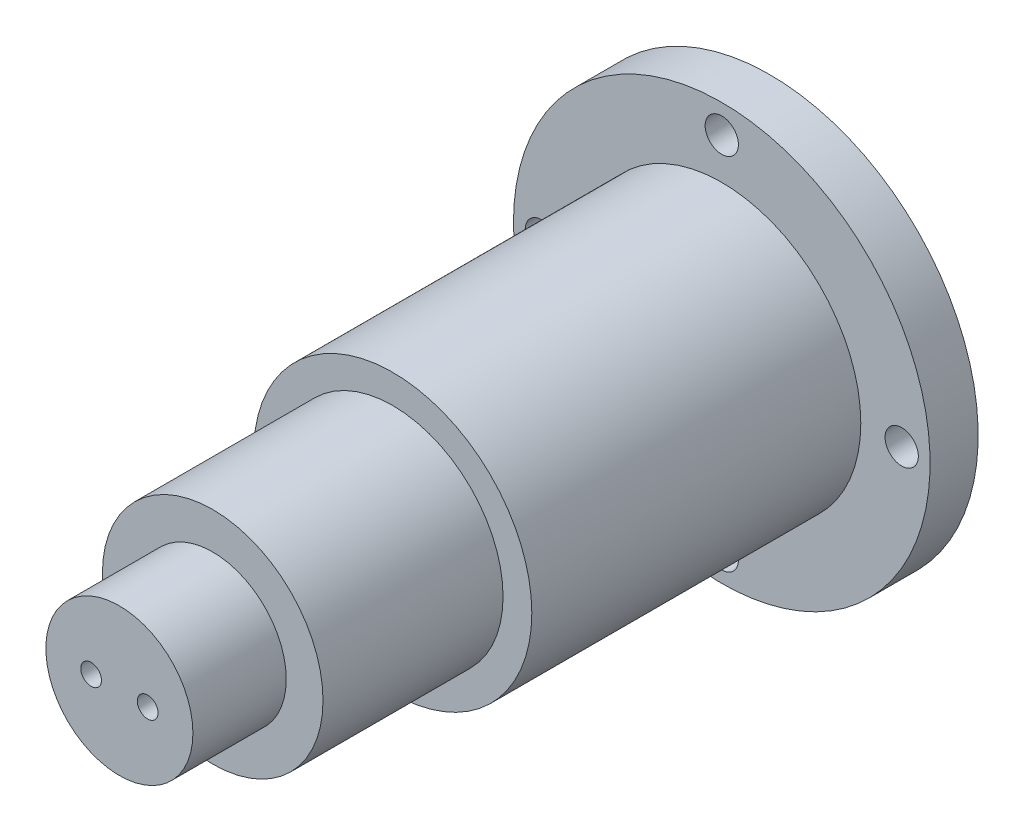
ISO-10303-21;
HEADER;
FILE_DESCRIPTION(('STEP AP214'),'2;1');
FILE_NAME('part.step','',(''),(''),'','','');
FILE_SCHEMA(('AUTOMOTIVE_DESIGN { 1 0 10303 214 1 1 1 1 }'));
ENDSEC;
DATA;
#1=APPLICATION_CONTEXT('core data for automotive mechanical design processes');
#2=APPLICATION_PROTOCOL_DEFINITION('international standard','automotive_design',2000,#1);
#3=PRODUCT_CONTEXT('',#1,'mechanical');
#4=PRODUCT('Part','Part','',(#3));
#5=PRODUCT_RELATED_PRODUCT_CATEGORY('part','',(#4));
#6=PRODUCT_DEFINITION_FORMATION('','',#4);
#7=PRODUCT_DEFINITION_CONTEXT('part definition',#1,'design');
#8=PRODUCT_DEFINITION('design','',#6,#7);
#9=PRODUCT_DEFINITION_SHAPE('','',#8);
#10=(LENGTH_UNIT() NAMED_UNIT(*) SI_UNIT(.MILLI.,.METRE.));
#11=(NAMED_UNIT(*) PLANE_ANGLE_UNIT() SI_UNIT($,.RADIAN.));
#12=(NAMED_UNIT(*) SI_UNIT($,.STERADIAN.) SOLID_ANGLE_UNIT());
#13=UNCERTAINTY_MEASURE_WITH_UNIT(LENGTH_MEASURE(1.E-05),#10,'distance_accuracy_value','');
#14=(GEOMETRIC_REPRESENTATION_CONTEXT(3) GLOBAL_UNCERTAINTY_ASSIGNED_CONTEXT((#13)) GLOBAL_UNIT_ASSIGNED_CONTEXT((#10,
#11,#12)) REPRESENTATION_CONTEXT('',''));
#15=CARTESIAN_POINT('',(0.,0.,0.));
#16=DIRECTION('',(0.,0.,1.));
#17=DIRECTION('',(1.,0.,0.));
#18=AXIS2_PLACEMENT_3D('',#15,#16,#17);
#19=CARTESIAN_POINT('',(0.,0.,5.1));
#20=DIRECTION('',(0.,0.,-1.));
#21=DIRECTION('',(-1.,0.,0.));
#22=AXIS2_PLACEMENT_3D('',#19,#20,#21);
#23=CYLINDRICAL_SURFACE('',#22,22.1);
#24=CARTESIAN_POINT('',(0.,0.,5.1));
#25=DIRECTION('',(0.,0.,-1.));
#26=DIRECTION('',(-1.,0.,0.));
#27=AXIS2_PLACEMENT_3D('',#24,#25,#26);
#28=CIRCLE('',#27,22.1);
#29=CARTESIAN_POINT('',(-22.1,0.,5.1));
#30=VERTEX_POINT('',#29);
#31=EDGE_CURVE('E82',#30,#30,#28,.T.);
#32=ORIENTED_EDGE('',*,*,#31,.T.);
#33=EDGE_LOOP('',(#32));
#34=FACE_BOUND('',#33,.T.);
#35=CARTESIAN_POINT('',(0.,0.,0.));
#36=DIRECTION('',(0.,0.,-1.));
#37=DIRECTION('',(-1.,0.,0.));
#38=AXIS2_PLACEMENT_3D('',#35,#36,#37);
#39=CIRCLE('',#38,22.1);
#40=CARTESIAN_POINT('',(-22.1,0.,0.));
#41=VERTEX_POINT('',#40);
#42=EDGE_CURVE('E77',#41,#41,#39,.T.);
#43=ORIENTED_EDGE('',*,*,#42,.F.);
#44=EDGE_LOOP('',(#43));
#45=FACE_BOUND('',#44,.T.);
#46=ADVANCED_FACE('F34',(#34,#45),#23,.T.);
#47=CARTESIAN_POINT('',(22.1,0.,5.1));
#48=DIRECTION('',(0.,0.,1.));
#49=DIRECTION('',(1.,0.,0.));
#50=AXIS2_PLACEMENT_3D('',#47,#48,#49);
#51=PLANE('',#50);
#52=CARTESIAN_POINT('',(0.,19.0875,5.1));
#53=DIRECTION('',(0.,0.,1.));
#54=DIRECTION('',(1.,0.,0.));
#55=AXIS2_PLACEMENT_3D('',#52,#53,#54);
#56=CIRCLE('',#55,1.76499999999998);
#57=CARTESIAN_POINT('',(1.76499999999999,19.0875,5.1));
#58=VERTEX_POINT('',#57);
#59=EDGE_CURVE('E173',#58,#58,#56,.T.);
#60=ORIENTED_EDGE('',*,*,#59,.F.);
#61=EDGE_LOOP('',(#60));
#62=FACE_BOUND('',#61,.T.);
#63=CARTESIAN_POINT('',(19.0875,0.,5.1));
#64=DIRECTION('',(0.,0.,1.));
#65=DIRECTION('',(1.,0.,0.));
#66=AXIS2_PLACEMENT_3D('',#63,#64,#65);
#67=CIRCLE('',#66,1.76499999999998);
#68=CARTESIAN_POINT('',(20.8525,0.,5.1));
#69=VERTEX_POINT('',#68);
#70=EDGE_CURVE('E168',#69,#69,#67,.T.);
#71=ORIENTED_EDGE('',*,*,#70,.F.);
#72=EDGE_LOOP('',(#71));
#73=FACE_BOUND('',#72,.T.);
#74=CARTESIAN_POINT('',(0.,-19.0875,5.1));
#75=DIRECTION('',(0.,0.,1.));
#76=DIRECTION('',(1.,0.,0.));
#77=AXIS2_PLACEMENT_3D('',#74,#75,#76);
#78=CIRCLE('',#77,1.76499999999998);
#79=CARTESIAN_POINT('',(1.76499999999998,-19.0875,5.1));
#80=VERTEX_POINT('',#79);
#81=EDGE_CURVE('E184',#80,#80,#78,.T.);
#82=ORIENTED_EDGE('',*,*,#81,.F.);
#83=EDGE_LOOP('',(#82));
#84=FACE_BOUND('',#83,.T.);
#85=CARTESIAN_POINT('',(-19.0875,0.,5.1));
#86=DIRECTION('',(0.,0.,1.));
#87=DIRECTION('',(1.,0.,0.));
#88=AXIS2_PLACEMENT_3D('',#85,#86,#87);
#89=CIRCLE('',#88,1.76499999999998);
#90=CARTESIAN_POINT('',(-17.3225,0.,5.1));
#91=VERTEX_POINT('',#90);
#92=EDGE_CURVE('E190',#91,#91,#89,.T.);
#93=ORIENTED_EDGE('',*,*,#92,.F.);
#94=EDGE_LOOP('',(#93));
#95=FACE_BOUND('',#94,.T.);
#96=CARTESIAN_POINT('',(0.,0.,5.1));
#97=DIRECTION('',(0.,0.,1.));
#98=DIRECTION('',(1.,0.,0.));
#99=AXIS2_PLACEMENT_3D('',#96,#97,#98);
#100=CIRCLE('',#99,14.75);
#101=CARTESIAN_POINT('',(14.75,0.,5.1));
#102=VERTEX_POINT('',#101);
#103=EDGE_CURVE('E71',#102,#102,#100,.T.);
#104=ORIENTED_EDGE('',*,*,#103,.F.);
#105=EDGE_LOOP('',(#104));
#106=FACE_BOUND('',#105,.T.);
#107=ORIENTED_EDGE('',*,*,#31,.F.);
#108=EDGE_LOOP('',(#107));
#109=FACE_BOUND('',#108,.T.);
#110=ADVANCED_FACE('F99',(#62,#73,#84,#95,#106,#109),#51,.T.);
#111=CARTESIAN_POINT('',(0.,0.,0.));
#112=DIRECTION('',(0.,0.,-1.));
#113=DIRECTION('',(-1.,0.,0.));
#114=AXIS2_PLACEMENT_3D('',#111,#112,#113);
#115=PLANE('',#114);
#116=CARTESIAN_POINT('',(0.,0.,0.));
#117=DIRECTION('',(0.,0.,-1.));
#118=DIRECTION('',(-1.,0.,0.));
#119=AXIS2_PLACEMENT_3D('',#116,#117,#118);
#120=CIRCLE('',#119,8.35000000000001);
#121=CARTESIAN_POINT('',(-8.35000000000001,0.,0.));
#122=VERTEX_POINT('',#121);
#123=EDGE_CURVE('E11',#122,#122,#120,.F.);
#124=ORIENTED_EDGE('',*,*,#123,.T.);
#125=EDGE_LOOP('',(#124));
#126=FACE_BOUND('',#125,.T.);
#127=CARTESIAN_POINT('',(0.,19.0875,0.));
#128=DIRECTION('',(0.,0.,-1.));
#129=DIRECTION('',(-1.,0.,0.));
#130=AXIS2_PLACEMENT_3D('',#127,#128,#129);
#131=CIRCLE('',#130,1.76499999999999);
#132=CARTESIAN_POINT('',(-1.76499999999998,19.0875,0.));
#133=VERTEX_POINT('',#132);
#134=EDGE_CURVE('E178',#133,#133,#131,.T.);
#135=ORIENTED_EDGE('',*,*,#134,.F.);
#136=EDGE_LOOP('',(#135));
#137=FACE_BOUND('',#136,.T.);
#138=CARTESIAN_POINT('',(19.0875,0.,0.));
#139=DIRECTION('',(0.,0.,-1.));
#140=DIRECTION('',(-1.,0.,0.));
#141=AXIS2_PLACEMENT_3D('',#138,#139,#140);
#142=CIRCLE('',#141,1.76499999999999);
#143=CARTESIAN_POINT('',(17.3225,0.,0.));
#144=VERTEX_POINT('',#143);
#145=EDGE_CURVE('E171',#144,#144,#142,.T.);
#146=ORIENTED_EDGE('',*,*,#145,.F.);
#147=EDGE_LOOP('',(#146));
#148=FACE_BOUND('',#147,.T.);
#149=CARTESIAN_POINT('',(0.,-19.0875,0.));
#150=DIRECTION('',(0.,0.,-1.));
#151=DIRECTION('',(-1.,0.,0.));
#152=AXIS2_PLACEMENT_3D('',#149,#150,#151);
#153=CIRCLE('',#152,1.76499999999999);
#154=CARTESIAN_POINT('',(-1.76499999999999,-19.0875,0.));
#155=VERTEX_POINT('',#154);
#156=EDGE_CURVE('E175',#155,#155,#153,.T.);
#157=ORIENTED_EDGE('',*,*,#156,.F.);
#158=EDGE_LOOP('',(#157));
#159=FACE_BOUND('',#158,.T.);
#160=CARTESIAN_POINT('',(-19.0875,0.,0.));
#161=DIRECTION('',(0.,0.,-1.));
#162=DIRECTION('',(-1.,0.,0.));
#163=AXIS2_PLACEMENT_3D('',#160,#161,#162);
#164=CIRCLE('',#163,1.76499999999999);
#165=CARTESIAN_POINT('',(-20.8525,0.,0.));
#166=VERTEX_POINT('',#165);
#167=EDGE_CURVE('E187',#166,#166,#164,.T.);
#168=ORIENTED_EDGE('',*,*,#167,.F.);
#169=EDGE_LOOP('',(#168));
#170=FACE_BOUND('',#169,.T.);
#171=ORIENTED_EDGE('',*,*,#42,.T.);
#172=EDGE_LOOP('',(#171));
#173=FACE_BOUND('',#172,.T.);
#174=ADVANCED_FACE('F104',(#126,#137,#148,#159,#170,#173),#115,.T.);
#175=CARTESIAN_POINT('',(0.,0.,40.));
#176=DIRECTION('',(0.,0.,-1.));
#177=DIRECTION('',(-1.,0.,0.));
#178=AXIS2_PLACEMENT_3D('',#175,#176,#177);
#179=CYLINDRICAL_SURFACE('',#178,14.75);
#180=CARTESIAN_POINT('',(0.,0.,40.));
#181=DIRECTION('',(0.,0.,1.));
#182=DIRECTION('',(1.,0.,0.));
#183=AXIS2_PLACEMENT_3D('',#180,#181,#182);
#184=CIRCLE('',#183,14.75);
#185=CARTESIAN_POINT('',(14.75,0.,40.));
#186=VERTEX_POINT('',#185);
#187=EDGE_CURVE('E74',#186,#186,#184,.T.);
#188=ORIENTED_EDGE('',*,*,#187,.F.);
#189=EDGE_LOOP('',(#188));
#190=FACE_BOUND('',#189,.T.);
#191=ORIENTED_EDGE('',*,*,#103,.T.);
#192=EDGE_LOOP('',(#191));
#193=FACE_BOUND('',#192,.T.);
#194=ADVANCED_FACE('F111',(#190,#193),#179,.T.);
#195=CARTESIAN_POINT('',(0.,0.,40.));
#196=DIRECTION('',(0.,0.,1.));
#197=DIRECTION('',(1.,0.,0.));
#198=AXIS2_PLACEMENT_3D('',#195,#196,#197);
#199=PLANE('',#198);
#200=CARTESIAN_POINT('',(0.,0.,40.));
#201=DIRECTION('',(0.,0.,1.));
#202=DIRECTION('',(1.,0.,0.));
#203=AXIS2_PLACEMENT_3D('',#200,#201,#202);
#204=CIRCLE('',#203,11.7);
#205=CARTESIAN_POINT('',(11.7,0.,40.));
#206=VERTEX_POINT('',#205);
#207=EDGE_CURVE('E66',#206,#206,#204,.T.);
#208=ORIENTED_EDGE('',*,*,#207,.F.);
#209=EDGE_LOOP('',(#208));
#210=FACE_BOUND('',#209,.T.);
#211=ORIENTED_EDGE('',*,*,#187,.T.);
#212=EDGE_LOOP('',(#211));
#213=FACE_BOUND('',#212,.T.);
#214=ADVANCED_FACE('F115',(#210,#213),#199,.T.);
#215=CARTESIAN_POINT('',(0.,0.,59.1));
#216=DIRECTION('',(0.,0.,-1.));
#217=DIRECTION('',(-1.,0.,0.));
#218=AXIS2_PLACEMENT_3D('',#215,#216,#217);
#219=CYLINDRICAL_SURFACE('',#218,11.7);
#220=CARTESIAN_POINT('',(0.,0.,59.1));
#221=DIRECTION('',(0.,0.,1.));
#222=DIRECTION('',(1.,0.,0.));
#223=AXIS2_PLACEMENT_3D('',#220,#221,#222);
#224=CIRCLE('',#223,11.7);
#225=CARTESIAN_POINT('',(11.7,0.,59.1));
#226=VERTEX_POINT('',#225);
#227=EDGE_CURVE('E68',#226,#226,#224,.T.);
#228=ORIENTED_EDGE('',*,*,#227,.F.);
#229=EDGE_LOOP('',(#228));
#230=FACE_BOUND('',#229,.T.);
#231=ORIENTED_EDGE('',*,*,#207,.T.);
#232=EDGE_LOOP('',(#231));
#233=FACE_BOUND('',#232,.T.);
#234=ADVANCED_FACE('F119',(#230,#233),#219,.T.);
#235=CARTESIAN_POINT('',(0.,0.,59.1));
#236=DIRECTION('',(0.,0.,1.));
#237=DIRECTION('',(1.,0.,0.));
#238=AXIS2_PLACEMENT_3D('',#235,#236,#237);
#239=PLANE('',#238);
#240=CARTESIAN_POINT('',(0.,0.,59.1));
#241=DIRECTION('',(0.,0.,1.));
#242=DIRECTION('',(1.,0.,0.));
#243=AXIS2_PLACEMENT_3D('',#240,#241,#242);
#244=CIRCLE('',#243,7.8);
#245=CARTESIAN_POINT('',(7.8,0.,59.1));
#246=VERTEX_POINT('',#245);
#247=EDGE_CURVE('E54',#246,#246,#244,.T.);
#248=ORIENTED_EDGE('',*,*,#247,.F.);
#249=EDGE_LOOP('',(#248));
#250=FACE_BOUND('',#249,.T.);
#251=ORIENTED_EDGE('',*,*,#227,.T.);
#252=EDGE_LOOP('',(#251));
#253=FACE_BOUND('',#252,.T.);
#254=ADVANCED_FACE('F123',(#250,#253),#239,.T.);
#255=CARTESIAN_POINT('',(0.,0.,69.));
#256=DIRECTION('',(0.,0.,-1.));
#257=DIRECTION('',(-1.,0.,0.));
#258=AXIS2_PLACEMENT_3D('',#255,#256,#257);
#259=CYLINDRICAL_SURFACE('',#258,7.8);
#260=CARTESIAN_POINT('',(0.,0.,69.));
#261=DIRECTION('',(0.,0.,1.));
#262=DIRECTION('',(1.,0.,0.));
#263=AXIS2_PLACEMENT_3D('',#260,#261,#262);
#264=CIRCLE('',#263,7.8);
#265=CARTESIAN_POINT('',(7.8,0.,69.));
#266=VERTEX_POINT('',#265);
#267=EDGE_CURVE('E58',#266,#266,#264,.T.);
#268=ORIENTED_EDGE('',*,*,#267,.F.);
#269=EDGE_LOOP('',(#268));
#270=FACE_BOUND('',#269,.T.);
#271=ORIENTED_EDGE('',*,*,#247,.T.);
#272=EDGE_LOOP('',(#271));
#273=FACE_BOUND('',#272,.T.);
#274=ADVANCED_FACE('F127',(#270,#273),#259,.T.);
#275=CARTESIAN_POINT('',(0.,0.,69.));
#276=DIRECTION('',(0.,0.,1.));
#277=DIRECTION('',(1.,0.,0.));
#278=AXIS2_PLACEMENT_3D('',#275,#276,#277);
#279=PLANE('',#278);
#280=CARTESIAN_POINT('',(-3.,0.,69.));
#281=DIRECTION('',(0.,0.,1.));
#282=DIRECTION('',(1.,0.,0.));
#283=AXIS2_PLACEMENT_3D('',#280,#281,#282);
#284=CIRCLE('',#283,1.09999999999999);
#285=CARTESIAN_POINT('',(-1.90000000000001,0.,69.));
#286=VERTEX_POINT('',#285);
#287=EDGE_CURVE('E193',#286,#286,#284,.T.);
#288=ORIENTED_EDGE('',*,*,#287,.F.);
#289=EDGE_LOOP('',(#288));
#290=FACE_BOUND('',#289,.T.);
#291=CARTESIAN_POINT('',(3.,0.,69.));
#292=DIRECTION('',(0.,0.,1.));
#293=DIRECTION('',(1.,0.,0.));
#294=AXIS2_PLACEMENT_3D('',#291,#292,#293);
#295=CIRCLE('',#294,1.09999999999999);
#296=CARTESIAN_POINT('',(4.09999999999999,0.,69.));
#297=VERTEX_POINT('',#296);
#298=EDGE_CURVE('E61',#297,#297,#295,.T.);
#299=ORIENTED_EDGE('',*,*,#298,.F.);
#300=EDGE_LOOP('',(#299));
#301=FACE_BOUND('',#300,.T.);
#302=ORIENTED_EDGE('',*,*,#267,.T.);
#303=EDGE_LOOP('',(#302));
#304=FACE_BOUND('',#303,.T.);
#305=ADVANCED_FACE('F48',(#290,#301,#304),#279,.T.);
#306=CARTESIAN_POINT('',(0.,0.,18.81));
#307=DIRECTION('',(0.,0.,-1.));
#308=DIRECTION('',(-1.,0.,0.));
#309=AXIS2_PLACEMENT_3D('',#306,#307,#308);
#310=CONICAL_SURFACE('',#309,6.34999999999999,1.02974425867665);
#311=CARTESIAN_POINT('',(0.,0.,22.625464930825));
#312=VERTEX_POINT('',#311);
#313=VERTEX_LOOP('',#312);
#314=FACE_BOUND('',#313,.T.);
#315=CARTESIAN_POINT('',(0.,0.,18.81));
#316=DIRECTION('',(0.,0.,-1.));
#317=DIRECTION('',(-1.,0.,0.));
#318=AXIS2_PLACEMENT_3D('',#315,#316,#317);
#319=CIRCLE('',#318,6.34999999999999);
#320=CARTESIAN_POINT('',(-6.34999999999999,0.,18.81));
#321=VERTEX_POINT('',#320);
#322=EDGE_CURVE('E52',#321,#321,#319,.T.);
#323=ORIENTED_EDGE('',*,*,#322,.T.);
#324=EDGE_LOOP('',(#323));
#325=FACE_BOUND('',#324,.T.);
#326=ADVANCED_FACE('F44',(#314,#325),#310,.F.);
#327=CARTESIAN_POINT('',(0.,0.,0.));
#328=DIRECTION('',(0.,0.,-1.));
#329=DIRECTION('',(-1.,0.,0.));
#330=AXIS2_PLACEMENT_3D('',#327,#328,#329);
#331=CYLINDRICAL_SURFACE('',#330,6.35);
#332=CARTESIAN_POINT('',(0.,0.,2.00000000000001));
#333=DIRECTION('',(0.,0.,-1.));
#334=DIRECTION('',(-1.,0.,0.));
#335=AXIS2_PLACEMENT_3D('',#332,#333,#334);
#336=CIRCLE('',#335,6.35);
#337=CARTESIAN_POINT('',(-6.35,0.,2.00000000000001));
#338=VERTEX_POINT('',#337);
#339=EDGE_CURVE('E41',#338,#338,#336,.T.);
#340=ORIENTED_EDGE('',*,*,#339,.T.);
#341=EDGE_LOOP('',(#340));
#342=FACE_BOUND('',#341,.T.);
#343=ORIENTED_EDGE('',*,*,#322,.F.);
#344=EDGE_LOOP('',(#343));
#345=FACE_BOUND('',#344,.T.);
#346=ADVANCED_FACE('F47',(#342,#345),#331,.F.);
#347=CARTESIAN_POINT('',(3.,0.,54.));
#348=DIRECTION('',(0.,0.,-1.));
#349=DIRECTION('',(-1.,0.,0.));
#350=AXIS2_PLACEMENT_3D('',#347,#348,#349);
#351=PLANE('',#350);
#352=CARTESIAN_POINT('',(3.,0.,54.));
#353=DIRECTION('',(0.,0.,1.));
#354=DIRECTION('',(1.,0.,0.));
#355=AXIS2_PLACEMENT_3D('',#352,#353,#354);
#356=CIRCLE('',#355,1.09999999999999);
#357=CARTESIAN_POINT('',(4.09999999999999,0.,54.));
#358=VERTEX_POINT('',#357);
#359=EDGE_CURVE('E55',#358,#358,#356,.T.);
#360=ORIENTED_EDGE('',*,*,#359,.T.);
#361=EDGE_LOOP('',(#360));
#362=FACE_BOUND('',#361,.T.);
#363=ADVANCED_FACE('F137',(#362),#351,.F.);
#364=CARTESIAN_POINT('',(3.,0.,69.));
#365=DIRECTION('',(0.,0.,1.));
#366=DIRECTION('',(1.,0.,0.));
#367=AXIS2_PLACEMENT_3D('',#364,#365,#366);
#368=CYLINDRICAL_SURFACE('',#367,1.09999999999999);
#369=ORIENTED_EDGE('',*,*,#359,.F.);
#370=EDGE_LOOP('',(#369));
#371=FACE_BOUND('',#370,.T.);
#372=ORIENTED_EDGE('',*,*,#298,.T.);
#373=EDGE_LOOP('',(#372));
#374=FACE_BOUND('',#373,.T.);
#375=ADVANCED_FACE('F140',(#371,#374),#368,.F.);
#376=CARTESIAN_POINT('',(-3.,0.,54.));
#377=DIRECTION('',(0.,0.,-1.));
#378=DIRECTION('',(-1.,0.,0.));
#379=AXIS2_PLACEMENT_3D('',#376,#377,#378);
#380=PLANE('',#379);
#381=CARTESIAN_POINT('',(-3.,0.,54.));
#382=DIRECTION('',(0.,0.,1.));
#383=DIRECTION('',(1.,0.,0.));
#384=AXIS2_PLACEMENT_3D('',#381,#382,#383);
#385=CIRCLE('',#384,1.09999999999999);
#386=CARTESIAN_POINT('',(-1.90000000000001,0.,54.));
#387=VERTEX_POINT('',#386);
#388=EDGE_CURVE('E196',#387,#387,#385,.T.);
#389=ORIENTED_EDGE('',*,*,#388,.T.);
#390=EDGE_LOOP('',(#389));
#391=FACE_BOUND('',#390,.T.);
#392=ADVANCED_FACE('F144',(#391),#380,.F.);
#393=CARTESIAN_POINT('',(-3.,0.,69.));
#394=DIRECTION('',(0.,0.,1.));
#395=DIRECTION('',(1.,0.,0.));
#396=AXIS2_PLACEMENT_3D('',#393,#394,#395);
#397=CYLINDRICAL_SURFACE('',#396,1.09999999999999);
#398=ORIENTED_EDGE('',*,*,#388,.F.);
#399=EDGE_LOOP('',(#398));
#400=FACE_BOUND('',#399,.T.);
#401=ORIENTED_EDGE('',*,*,#287,.T.);
#402=EDGE_LOOP('',(#401));
#403=FACE_BOUND('',#402,.T.);
#404=ADVANCED_FACE('F148',(#400,#403),#397,.F.);
#405=CARTESIAN_POINT('',(-19.0875,0.,0.));
#406=DIRECTION('',(0.,0.,-1.));
#407=DIRECTION('',(-1.,0.,0.));
#408=AXIS2_PLACEMENT_3D('',#405,#406,#407);
#409=CYLINDRICAL_SURFACE('',#408,1.76499999999998);
#410=ORIENTED_EDGE('',*,*,#92,.T.);
#411=EDGE_LOOP('',(#410));
#412=FACE_BOUND('',#411,.T.);
#413=ORIENTED_EDGE('',*,*,#167,.T.);
#414=EDGE_LOOP('',(#413));
#415=FACE_BOUND('',#414,.T.);
#416=ADVANCED_FACE('F152',(#412,#415),#409,.F.);
#417=CARTESIAN_POINT('',(0.,-19.0875,0.));
#418=DIRECTION('',(0.,0.,-1.));
#419=DIRECTION('',(-1.,0.,0.));
#420=AXIS2_PLACEMENT_3D('',#417,#418,#419);
#421=CYLINDRICAL_SURFACE('',#420,1.76499999999998);
#422=ORIENTED_EDGE('',*,*,#81,.T.);
#423=EDGE_LOOP('',(#422));
#424=FACE_BOUND('',#423,.T.);
#425=ORIENTED_EDGE('',*,*,#156,.T.);
#426=EDGE_LOOP('',(#425));
#427=FACE_BOUND('',#426,.T.);
#428=ADVANCED_FACE('F156',(#424,#427),#421,.F.);
#429=CARTESIAN_POINT('',(19.0875,0.,0.));
#430=DIRECTION('',(0.,0.,-1.));
#431=DIRECTION('',(-1.,0.,0.));
#432=AXIS2_PLACEMENT_3D('',#429,#430,#431);
#433=CYLINDRICAL_SURFACE('',#432,1.76499999999998);
#434=ORIENTED_EDGE('',*,*,#70,.T.);
#435=EDGE_LOOP('',(#434));
#436=FACE_BOUND('',#435,.T.);
#437=ORIENTED_EDGE('',*,*,#145,.T.);
#438=EDGE_LOOP('',(#437));
#439=FACE_BOUND('',#438,.T.);
#440=ADVANCED_FACE('F94',(#436,#439),#433,.F.);
#441=CARTESIAN_POINT('',(0.,19.0875,0.));
#442=DIRECTION('',(0.,0.,-1.));
#443=DIRECTION('',(-1.,0.,0.));
#444=AXIS2_PLACEMENT_3D('',#441,#442,#443);
#445=CYLINDRICAL_SURFACE('',#444,1.76499999999998);
#446=ORIENTED_EDGE('',*,*,#59,.T.);
#447=EDGE_LOOP('',(#446));
#448=FACE_BOUND('',#447,.T.);
#449=ORIENTED_EDGE('',*,*,#134,.T.);
#450=EDGE_LOOP('',(#449));
#451=FACE_BOUND('',#450,.T.);
#452=ADVANCED_FACE('F89',(#448,#451),#445,.F.);
#453=CARTESIAN_POINT('',(0.,0.,2.00000000000001));
#454=DIRECTION('',(0.,0.,-1.));
#455=DIRECTION('',(-1.,0.,0.));
#456=AXIS2_PLACEMENT_3D('',#453,#454,#455);
#457=CONICAL_SURFACE('',#456,6.35,0.78539816339745);
#458=ORIENTED_EDGE('',*,*,#123,.F.);
#459=EDGE_LOOP('',(#458));
#460=FACE_BOUND('',#459,.T.);
#461=ORIENTED_EDGE('',*,*,#339,.F.);
#462=EDGE_LOOP('',(#461));
#463=FACE_BOUND('',#462,.T.);
#464=ADVANCED_FACE('F36',(#460,#463),#457,.F.);
#465=CLOSED_SHELL('',(#46,#110,#174,#194,#214,#234,#254,#274,#305,#326,#346,#363,#375,#392,#404,
#416,#428,#440,#452,#464));
#466=MANIFOLD_SOLID_BREP('B2',#465);
#467=ADVANCED_BREP_SHAPE_REPRESENTATION('',(#18,#466),#14);
#468=SHAPE_DEFINITION_REPRESENTATION(#9,#467);
ENDSEC;
END-ISO-10303-21;
